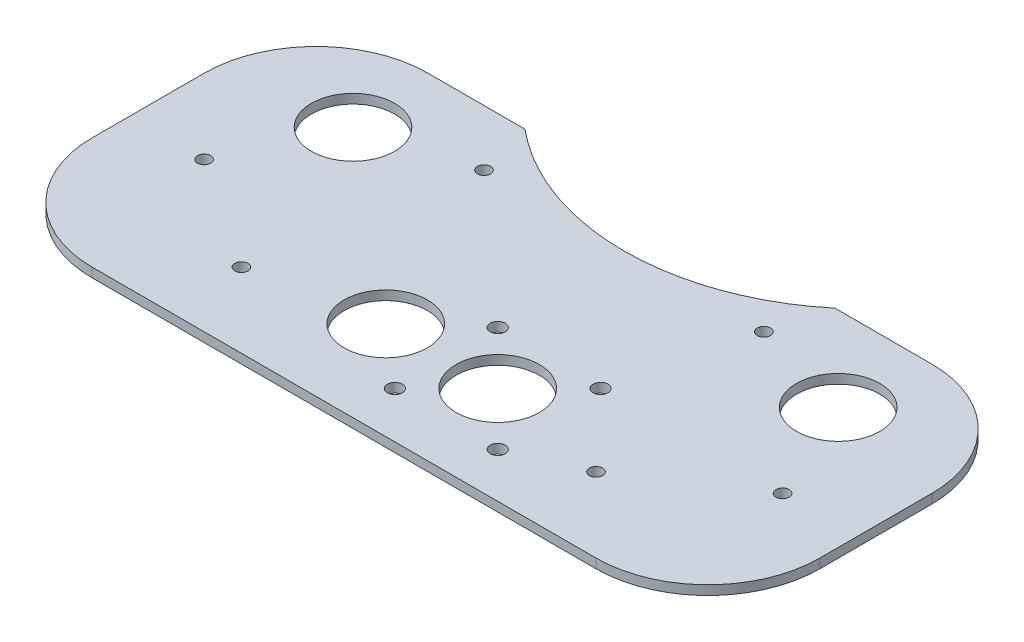
ISO-10303-21;
HEADER;
FILE_DESCRIPTION(('STEP AP214'),'2;1');
FILE_NAME('part.step','',(''),(''),'','','');
FILE_SCHEMA(('AUTOMOTIVE_DESIGN { 1 0 10303 214 1 1 1 1 }'));
ENDSEC;
DATA;
#1=APPLICATION_CONTEXT('core data for automotive mechanical design processes');
#2=APPLICATION_PROTOCOL_DEFINITION('international standard','automotive_design',2000,#1);
#3=PRODUCT_CONTEXT('',#1,'mechanical');
#4=PRODUCT('Part','Part','',(#3));
#5=PRODUCT_RELATED_PRODUCT_CATEGORY('part','',(#4));
#6=PRODUCT_DEFINITION_FORMATION('','',#4);
#7=PRODUCT_DEFINITION_CONTEXT('part definition',#1,'design');
#8=PRODUCT_DEFINITION('design','',#6,#7);
#9=PRODUCT_DEFINITION_SHAPE('','',#8);
#10=(LENGTH_UNIT() NAMED_UNIT(*) SI_UNIT(.MILLI.,.METRE.));
#11=(NAMED_UNIT(*) PLANE_ANGLE_UNIT() SI_UNIT($,.RADIAN.));
#12=(NAMED_UNIT(*) SI_UNIT($,.STERADIAN.) SOLID_ANGLE_UNIT());
#13=UNCERTAINTY_MEASURE_WITH_UNIT(LENGTH_MEASURE(1.E-05),#10,'distance_accuracy_value','');
#14=(GEOMETRIC_REPRESENTATION_CONTEXT(3) GLOBAL_UNCERTAINTY_ASSIGNED_CONTEXT((#13)) GLOBAL_UNIT_ASSIGNED_CONTEXT((#10,
#11,#12)) REPRESENTATION_CONTEXT('',''));
#15=CARTESIAN_POINT('',(0.,0.,0.));
#16=DIRECTION('',(0.,0.,1.));
#17=DIRECTION('',(1.,0.,0.));
#18=AXIS2_PLACEMENT_3D('',#15,#16,#17);
#19=CARTESIAN_POINT('',(0.,3.175,-120.65));
#20=DIRECTION('',(0.,1.,0.));
#21=DIRECTION('',(0.,0.,1.));
#22=AXIS2_PLACEMENT_3D('',#19,#20,#21);
#23=PLANE('',#22);
#24=CARTESIAN_POINT('',(-19.05,3.175,23.9069424475209));
#25=DIRECTION('',(0.,-1.,0.));
#26=DIRECTION('',(0.,0.,-1.));
#27=AXIS2_PLACEMENT_3D('',#24,#25,#26);
#28=CIRCLE('',#27,14.1605);
#29=CARTESIAN_POINT('',(-19.05,3.175,9.74644244752094));
#30=VERTEX_POINT('',#29);
#31=EDGE_CURVE('E401',#30,#30,#28,.T.);
#32=ORIENTED_EDGE('',*,*,#31,.T.);
#33=EDGE_LOOP('',(#32));
#34=FACE_BOUND('',#33,.T.);
#35=CARTESIAN_POINT('',(-98.425,3.175,6.34999999999999));
#36=DIRECTION('',(0.,1.,0.));
#37=DIRECTION('',(0.,0.,1.));
#38=AXIS2_PLACEMENT_3D('',#35,#36,#37);
#39=CIRCLE('',#38,2.24789999999998);
#40=CARTESIAN_POINT('',(-98.425,3.175,8.59789999999998));
#41=VERTEX_POINT('',#40);
#42=EDGE_CURVE('E405',#41,#41,#39,.T.);
#43=ORIENTED_EDGE('',*,*,#42,.F.);
#44=EDGE_LOOP('',(#43));
#45=FACE_BOUND('',#44,.T.);
#46=CARTESIAN_POINT('',(-60.325,3.175,31.75));
#47=DIRECTION('',(0.,1.,0.));
#48=DIRECTION('',(0.,0.,1.));
#49=AXIS2_PLACEMENT_3D('',#46,#47,#48);
#50=CIRCLE('',#49,2.24789999999998);
#51=CARTESIAN_POINT('',(-60.325,3.175,33.9979));
#52=VERTEX_POINT('',#51);
#53=EDGE_CURVE('E414',#52,#52,#50,.T.);
#54=ORIENTED_EDGE('',*,*,#53,.F.);
#55=EDGE_LOOP('',(#54));
#56=FACE_BOUND('',#55,.T.);
#57=CARTESIAN_POINT('',(-47.625,3.175,-38.1));
#58=DIRECTION('',(0.,1.,0.));
#59=DIRECTION('',(0.,0.,1.));
#60=AXIS2_PLACEMENT_3D('',#57,#58,#59);
#61=CIRCLE('',#60,2.24789999999998);
#62=CARTESIAN_POINT('',(-47.625,3.175,-35.8521));
#63=VERTEX_POINT('',#62);
#64=EDGE_CURVE('E420',#63,#63,#61,.T.);
#65=ORIENTED_EDGE('',*,*,#64,.F.);
#66=EDGE_LOOP('',(#65));
#67=FACE_BOUND('',#66,.T.);
#68=CARTESIAN_POINT('',(47.625,3.175,-38.1));
#69=DIRECTION('',(0.,1.,0.));
#70=DIRECTION('',(0.,0.,1.));
#71=AXIS2_PLACEMENT_3D('',#68,#69,#70);
#72=CIRCLE('',#71,2.24789999999998);
#73=CARTESIAN_POINT('',(47.625,3.175,-35.8521));
#74=VERTEX_POINT('',#73);
#75=EDGE_CURVE('E426',#74,#74,#72,.T.);
#76=ORIENTED_EDGE('',*,*,#75,.F.);
#77=EDGE_LOOP('',(#76));
#78=FACE_BOUND('',#77,.T.);
#79=CARTESIAN_POINT('',(60.325,3.175,31.75));
#80=DIRECTION('',(0.,1.,0.));
#81=DIRECTION('',(0.,0.,1.));
#82=AXIS2_PLACEMENT_3D('',#79,#80,#81);
#83=CIRCLE('',#82,2.24789999999998);
#84=CARTESIAN_POINT('',(60.325,3.175,33.9979));
#85=VERTEX_POINT('',#84);
#86=EDGE_CURVE('E432',#85,#85,#83,.T.);
#87=ORIENTED_EDGE('',*,*,#86,.F.);
#88=EDGE_LOOP('',(#87));
#89=FACE_BOUND('',#88,.T.);
#90=CARTESIAN_POINT('',(98.425,3.175,6.34999999999999));
#91=DIRECTION('',(0.,1.,0.));
#92=DIRECTION('',(0.,0.,1.));
#93=AXIS2_PLACEMENT_3D('',#90,#91,#92);
#94=CIRCLE('',#93,2.24789999999998);
#95=CARTESIAN_POINT('',(98.425,3.175,8.59789999999998));
#96=VERTEX_POINT('',#95);
#97=EDGE_CURVE('E334',#96,#96,#94,.T.);
#98=ORIENTED_EDGE('',*,*,#97,.F.);
#99=EDGE_LOOP('',(#98));
#100=FACE_BOUND('',#99,.T.);
#101=DIRECTION('',(0.,0.,-1.));
#102=VECTOR('',#101,1.);
#103=CARTESIAN_POINT('',(-123.825,3.175,57.15));
#104=LINE('',#103,#102);
#105=CARTESIAN_POINT('',(-123.825,3.175,19.05));
#106=VERTEX_POINT('',#105);
#107=CARTESIAN_POINT('',(-123.825,3.175,-19.05));
#108=VERTEX_POINT('',#107);
#109=EDGE_CURVE('E135',#106,#108,#104,.T.);
#110=ORIENTED_EDGE('',*,*,#109,.F.);
#111=CARTESIAN_POINT('',(-85.725,3.175,19.05));
#112=DIRECTION('',(0.,1.,0.));
#113=DIRECTION('',(0.,0.,1.));
#114=AXIS2_PLACEMENT_3D('',#111,#112,#113);
#115=CIRCLE('',#114,38.1);
#116=CARTESIAN_POINT('',(-85.725,3.175,57.15));
#117=VERTEX_POINT('',#116);
#118=EDGE_CURVE('E189',#106,#117,#115,.T.);
#119=ORIENTED_EDGE('',*,*,#118,.T.);
#120=DIRECTION('',(1.,0.,0.));
#121=VECTOR('',#120,1.);
#122=CARTESIAN_POINT('',(-123.825,3.175,57.15));
#123=LINE('',#122,#121);
#124=CARTESIAN_POINT('',(85.725,3.175,57.15));
#125=VERTEX_POINT('',#124);
#126=EDGE_CURVE('E147',#117,#125,#123,.T.);
#127=ORIENTED_EDGE('',*,*,#126,.T.);
#128=CARTESIAN_POINT('',(85.725,3.175,19.05));
#129=DIRECTION('',(0.,1.,0.));
#130=DIRECTION('',(0.,0.,1.));
#131=AXIS2_PLACEMENT_3D('',#128,#129,#130);
#132=CIRCLE('',#131,38.1);
#133=CARTESIAN_POINT('',(123.825,3.175,19.05));
#134=VERTEX_POINT('',#133);
#135=EDGE_CURVE('E187',#125,#134,#132,.T.);
#136=ORIENTED_EDGE('',*,*,#135,.T.);
#137=DIRECTION('',(0.,0.,-1.));
#138=VECTOR('',#137,1.);
#139=CARTESIAN_POINT('',(123.825,3.175,57.15));
#140=LINE('',#139,#138);
#141=CARTESIAN_POINT('',(123.825,3.175,-19.05));
#142=VERTEX_POINT('',#141);
#143=EDGE_CURVE('E142',#134,#142,#140,.T.);
#144=ORIENTED_EDGE('',*,*,#143,.T.);
#145=CARTESIAN_POINT('',(85.725,3.175,-19.05));
#146=DIRECTION('',(0.,1.,0.));
#147=DIRECTION('',(0.,0.,1.));
#148=AXIS2_PLACEMENT_3D('',#145,#146,#147);
#149=CIRCLE('',#148,38.1);
#150=CARTESIAN_POINT('',(85.725,3.175,-57.15));
#151=VERTEX_POINT('',#150);
#152=EDGE_CURVE('E53',#142,#151,#149,.T.);
#153=ORIENTED_EDGE('',*,*,#152,.T.);
#154=DIRECTION('',(-1.,0.,0.));
#155=VECTOR('',#154,1.);
#156=CARTESIAN_POINT('',(123.825,3.175,-57.15));
#157=LINE('',#156,#155);
#158=CARTESIAN_POINT('',(52.7470615295298,3.175,-57.15));
#159=VERTEX_POINT('',#158);
#160=EDGE_CURVE('E139',#151,#159,#157,.T.);
#161=ORIENTED_EDGE('',*,*,#160,.T.);
#162=CARTESIAN_POINT('',(0.,3.175,-120.65));
#163=DIRECTION('',(0.,1.,0.));
#164=DIRECTION('',(0.,0.,1.));
#165=AXIS2_PLACEMENT_3D('',#162,#163,#164);
#166=CIRCLE('',#165,82.55);
#167=CARTESIAN_POINT('',(-52.7470615295298,3.175,-57.15));
#168=VERTEX_POINT('',#167);
#169=EDGE_CURVE('E125',#168,#159,#166,.T.);
#170=ORIENTED_EDGE('',*,*,#169,.F.);
#171=DIRECTION('',(1.,0.,0.));
#172=VECTOR('',#171,1.);
#173=CARTESIAN_POINT('',(-123.825,3.175,-57.15));
#174=LINE('',#173,#172);
#175=CARTESIAN_POINT('',(-85.725,3.175,-57.15));
#176=VERTEX_POINT('',#175);
#177=EDGE_CURVE('E116',#176,#168,#174,.T.);
#178=ORIENTED_EDGE('',*,*,#177,.F.);
#179=CARTESIAN_POINT('',(-85.725,3.175,-19.05));
#180=DIRECTION('',(0.,1.,0.));
#181=DIRECTION('',(0.,0.,1.));
#182=AXIS2_PLACEMENT_3D('',#179,#180,#181);
#183=CIRCLE('',#182,38.1);
#184=EDGE_CURVE('E184',#176,#108,#183,.T.);
#185=ORIENTED_EDGE('',*,*,#184,.T.);
#186=EDGE_LOOP('',(#110,#119,#127,#136,#144,#153,#161,#170,#178,#185));
#187=FACE_BOUND('',#186,.T.);
#188=CARTESIAN_POINT('',(19.05,3.175,23.9069424475209));
#189=DIRECTION('',(0.,1.,0.));
#190=DIRECTION('',(0.,0.,1.));
#191=AXIS2_PLACEMENT_3D('',#188,#189,#190);
#192=CIRCLE('',#191,14.1605);
#193=CARTESIAN_POINT('',(19.05,3.175,38.0674424475209));
#194=VERTEX_POINT('',#193);
#195=EDGE_CURVE('E297',#194,#194,#192,.T.);
#196=ORIENTED_EDGE('',*,*,#195,.F.);
#197=EDGE_LOOP('',(#196));
#198=FACE_BOUND('',#197,.T.);
#199=CARTESIAN_POINT('',(37.0105122421383,3.175,41.8674546896592));
#200=DIRECTION('',(0.,1.,0.));
#201=DIRECTION('',(0.,0.,1.));
#202=AXIS2_PLACEMENT_3D('',#199,#200,#201);
#203=CIRCLE('',#202,2.5527);
#204=CARTESIAN_POINT('',(37.0105122421383,3.175,44.4201546896592));
#205=VERTEX_POINT('',#204);
#206=EDGE_CURVE('E293',#205,#205,#203,.T.);
#207=ORIENTED_EDGE('',*,*,#206,.F.);
#208=EDGE_LOOP('',(#207));
#209=FACE_BOUND('',#208,.T.);
#210=CARTESIAN_POINT('',(1.08948775786164,3.175,5.94643020538265));
#211=DIRECTION('',(0.,1.,0.));
#212=DIRECTION('',(0.,0.,1.));
#213=AXIS2_PLACEMENT_3D('',#210,#211,#212);
#214=CIRCLE('',#213,2.5527);
#215=CARTESIAN_POINT('',(1.08948775786164,3.175,8.49913020538265));
#216=VERTEX_POINT('',#215);
#217=EDGE_CURVE('E300',#216,#216,#214,.T.);
#218=ORIENTED_EDGE('',*,*,#217,.F.);
#219=EDGE_LOOP('',(#218));
#220=FACE_BOUND('',#219,.T.);
#221=CARTESIAN_POINT('',(36.55,3.175,6.40694244752094));
#222=DIRECTION('',(0.,1.,0.));
#223=DIRECTION('',(0.,0.,1.));
#224=AXIS2_PLACEMENT_3D('',#221,#222,#223);
#225=CIRCLE('',#224,2.5527);
#226=CARTESIAN_POINT('',(36.55,3.175,8.95964244752094));
#227=VERTEX_POINT('',#226);
#228=EDGE_CURVE('E317',#227,#227,#225,.T.);
#229=ORIENTED_EDGE('',*,*,#228,.F.);
#230=EDGE_LOOP('',(#229));
#231=FACE_BOUND('',#230,.T.);
#232=CARTESIAN_POINT('',(1.54999999999999,3.175,41.4069424475209));
#233=DIRECTION('',(0.,1.,0.));
#234=DIRECTION('',(0.,0.,1.));
#235=AXIS2_PLACEMENT_3D('',#232,#233,#234);
#236=CIRCLE('',#235,2.5527);
#237=CARTESIAN_POINT('',(1.54999999999999,3.175,43.9596424475209));
#238=VERTEX_POINT('',#237);
#239=EDGE_CURVE('E321',#238,#238,#236,.T.);
#240=ORIENTED_EDGE('',*,*,#239,.F.);
#241=EDGE_LOOP('',(#240));
#242=FACE_BOUND('',#241,.T.);
#243=CARTESIAN_POINT('',(82.55,3.175,-28.448));
#244=DIRECTION('',(0.,-1.,0.));
#245=DIRECTION('',(0.,0.,-1.));
#246=AXIS2_PLACEMENT_3D('',#243,#244,#245);
#247=CIRCLE('',#246,14.1605);
#248=CARTESIAN_POINT('',(82.55,3.175,-42.6085));
#249=VERTEX_POINT('',#248);
#250=EDGE_CURVE('E325',#249,#249,#247,.T.);
#251=ORIENTED_EDGE('',*,*,#250,.T.);
#252=EDGE_LOOP('',(#251));
#253=FACE_BOUND('',#252,.T.);
#254=CARTESIAN_POINT('',(-82.55,3.175,-28.448));
#255=DIRECTION('',(0.,-1.,0.));
#256=DIRECTION('',(0.,0.,-1.));
#257=AXIS2_PLACEMENT_3D('',#254,#255,#256);
#258=CIRCLE('',#257,14.1605);
#259=CARTESIAN_POINT('',(-82.55,3.175,-42.6085));
#260=VERTEX_POINT('',#259);
#261=EDGE_CURVE('E328',#260,#260,#258,.T.);
#262=ORIENTED_EDGE('',*,*,#261,.T.);
#263=EDGE_LOOP('',(#262));
#264=FACE_BOUND('',#263,.T.);
#265=ADVANCED_FACE('F37',(#34,#45,#56,#67,#78,#89,#100,#187,#198,#209,#220,#231,#242,#253,#264),
#23,.T.);
#266=CARTESIAN_POINT('',(-123.825,3.175,-57.15));
#267=DIRECTION('',(0.,0.,-1.));
#268=DIRECTION('',(-1.,0.,0.));
#269=AXIS2_PLACEMENT_3D('',#266,#267,#268);
#270=PLANE('',#269);
#271=DIRECTION('',(1.,0.,0.));
#272=VECTOR('',#271,1.);
#273=CARTESIAN_POINT('',(-123.825,0.,-57.15));
#274=LINE('',#273,#272);
#275=CARTESIAN_POINT('',(-85.725,0.,-57.15));
#276=VERTEX_POINT('',#275);
#277=CARTESIAN_POINT('',(-52.7470615295298,0.,-57.15));
#278=VERTEX_POINT('',#277);
#279=EDGE_CURVE('E152',#276,#278,#274,.T.);
#280=ORIENTED_EDGE('',*,*,#279,.F.);
#281=DIRECTION('',(0.,-1.,0.));
#282=VECTOR('',#281,1.);
#283=CARTESIAN_POINT('',(-85.725,3.175,-57.15));
#284=LINE('',#283,#282);
#285=EDGE_CURVE('E11',#276,#176,#284,.F.);
#286=ORIENTED_EDGE('',*,*,#285,.T.);
#287=ORIENTED_EDGE('',*,*,#177,.T.);
#288=DIRECTION('',(0.,-1.,0.));
#289=VECTOR('',#288,1.);
#290=CARTESIAN_POINT('',(-52.7470615295298,3.175,-57.15));
#291=LINE('',#290,#289);
#292=EDGE_CURVE('E120',#168,#278,#291,.T.);
#293=ORIENTED_EDGE('',*,*,#292,.T.);
#294=EDGE_LOOP('',(#280,#286,#287,#293));
#295=FACE_BOUND('',#294,.T.);
#296=ADVANCED_FACE('F119',(#295),#270,.T.);
#297=CARTESIAN_POINT('',(-123.825,3.175,57.15));
#298=DIRECTION('',(-1.,0.,0.));
#299=DIRECTION('',(0.,0.,1.));
#300=AXIS2_PLACEMENT_3D('',#297,#298,#299);
#301=PLANE('',#300);
#302=DIRECTION('',(0.,0.,-1.));
#303=VECTOR('',#302,1.);
#304=CARTESIAN_POINT('',(-123.825,0.,57.15));
#305=LINE('',#304,#303);
#306=CARTESIAN_POINT('',(-123.825,0.,19.05));
#307=VERTEX_POINT('',#306);
#308=CARTESIAN_POINT('',(-123.825,0.,-19.05));
#309=VERTEX_POINT('',#308);
#310=EDGE_CURVE('E126',#307,#309,#305,.T.);
#311=ORIENTED_EDGE('',*,*,#310,.F.);
#312=DIRECTION('',(0.,-1.,0.));
#313=VECTOR('',#312,1.);
#314=CARTESIAN_POINT('',(-123.825,3.175,19.05));
#315=LINE('',#314,#313);
#316=EDGE_CURVE('E182',#307,#106,#315,.F.);
#317=ORIENTED_EDGE('',*,*,#316,.T.);
#318=ORIENTED_EDGE('',*,*,#109,.T.);
#319=DIRECTION('',(0.,-1.,0.));
#320=VECTOR('',#319,1.);
#321=CARTESIAN_POINT('',(-123.825,3.175,-19.05));
#322=LINE('',#321,#320);
#323=EDGE_CURVE('E179',#108,#309,#322,.T.);
#324=ORIENTED_EDGE('',*,*,#323,.T.);
#325=EDGE_LOOP('',(#311,#317,#318,#324));
#326=FACE_BOUND('',#325,.T.);
#327=ADVANCED_FACE('F210',(#326),#301,.T.);
#328=CARTESIAN_POINT('',(-123.825,3.175,57.15));
#329=DIRECTION('',(0.,0.,-1.));
#330=DIRECTION('',(-1.,0.,0.));
#331=AXIS2_PLACEMENT_3D('',#328,#329,#330);
#332=PLANE('',#331);
#333=ORIENTED_EDGE('',*,*,#126,.F.);
#334=DIRECTION('',(0.,-1.,0.));
#335=VECTOR('',#334,1.);
#336=CARTESIAN_POINT('',(-85.725,0.,57.15));
#337=LINE('',#336,#335);
#338=CARTESIAN_POINT('',(-85.725,0.,57.15));
#339=VERTEX_POINT('',#338);
#340=EDGE_CURVE('E168',#117,#339,#337,.T.);
#341=ORIENTED_EDGE('',*,*,#340,.T.);
#342=DIRECTION('',(1.,0.,0.));
#343=VECTOR('',#342,1.);
#344=CARTESIAN_POINT('',(-123.825,0.,57.15));
#345=LINE('',#344,#343);
#346=CARTESIAN_POINT('',(85.725,0.,57.15));
#347=VERTEX_POINT('',#346);
#348=EDGE_CURVE('E160',#339,#347,#345,.T.);
#349=ORIENTED_EDGE('',*,*,#348,.T.);
#350=DIRECTION('',(0.,-1.,0.));
#351=VECTOR('',#350,1.);
#352=CARTESIAN_POINT('',(85.725,3.175,57.15));
#353=LINE('',#352,#351);
#354=EDGE_CURVE('E165',#347,#125,#353,.F.);
#355=ORIENTED_EDGE('',*,*,#354,.T.);
#356=EDGE_LOOP('',(#333,#341,#349,#355));
#357=FACE_BOUND('',#356,.T.);
#358=ADVANCED_FACE('F218',(#357),#332,.F.);
#359=CARTESIAN_POINT('',(123.825,3.175,57.15));
#360=DIRECTION('',(-1.,0.,0.));
#361=DIRECTION('',(0.,0.,1.));
#362=AXIS2_PLACEMENT_3D('',#359,#360,#361);
#363=PLANE('',#362);
#364=ORIENTED_EDGE('',*,*,#143,.F.);
#365=DIRECTION('',(0.,-1.,0.));
#366=VECTOR('',#365,1.);
#367=CARTESIAN_POINT('',(123.825,3.175,19.05));
#368=LINE('',#367,#366);
#369=CARTESIAN_POINT('',(123.825,0.,19.05));
#370=VERTEX_POINT('',#369);
#371=EDGE_CURVE('E192',#134,#370,#368,.T.);
#372=ORIENTED_EDGE('',*,*,#371,.T.);
#373=DIRECTION('',(0.,0.,-1.));
#374=VECTOR('',#373,1.);
#375=CARTESIAN_POINT('',(123.825,0.,57.15));
#376=LINE('',#375,#374);
#377=CARTESIAN_POINT('',(123.825,0.,-19.05));
#378=VERTEX_POINT('',#377);
#379=EDGE_CURVE('E158',#370,#378,#376,.T.);
#380=ORIENTED_EDGE('',*,*,#379,.T.);
#381=DIRECTION('',(0.,-1.,0.));
#382=VECTOR('',#381,1.);
#383=CARTESIAN_POINT('',(123.825,3.175,-19.05));
#384=LINE('',#383,#382);
#385=EDGE_CURVE('E61',#378,#142,#384,.F.);
#386=ORIENTED_EDGE('',*,*,#385,.T.);
#387=EDGE_LOOP('',(#364,#372,#380,#386));
#388=FACE_BOUND('',#387,.T.);
#389=ADVANCED_FACE('F223',(#388),#363,.F.);
#390=CARTESIAN_POINT('',(123.825,3.175,-57.15));
#391=DIRECTION('',(0.,0.,1.));
#392=DIRECTION('',(1.,0.,0.));
#393=AXIS2_PLACEMENT_3D('',#390,#391,#392);
#394=PLANE('',#393);
#395=ORIENTED_EDGE('',*,*,#160,.F.);
#396=DIRECTION('',(0.,-1.,0.));
#397=VECTOR('',#396,1.);
#398=CARTESIAN_POINT('',(85.725,3.175,-57.15));
#399=LINE('',#398,#397);
#400=CARTESIAN_POINT('',(85.725,0.,-57.15));
#401=VERTEX_POINT('',#400);
#402=EDGE_CURVE('E46',#151,#401,#399,.T.);
#403=ORIENTED_EDGE('',*,*,#402,.T.);
#404=DIRECTION('',(-1.,0.,0.));
#405=VECTOR('',#404,1.);
#406=CARTESIAN_POINT('',(123.825,0.,-57.15));
#407=LINE('',#406,#405);
#408=CARTESIAN_POINT('',(52.7470615295298,0.,-57.15));
#409=VERTEX_POINT('',#408);
#410=EDGE_CURVE('E156',#401,#409,#407,.T.);
#411=ORIENTED_EDGE('',*,*,#410,.T.);
#412=DIRECTION('',(0.,-1.,0.));
#413=VECTOR('',#412,1.);
#414=CARTESIAN_POINT('',(52.7470615295298,3.175,-57.15));
#415=LINE('',#414,#413);
#416=EDGE_CURVE('E134',#159,#409,#415,.T.);
#417=ORIENTED_EDGE('',*,*,#416,.F.);
#418=EDGE_LOOP('',(#395,#403,#411,#417));
#419=FACE_BOUND('',#418,.T.);
#420=ADVANCED_FACE('F199',(#419),#394,.F.);
#421=CARTESIAN_POINT('',(0.,3.175,-120.65));
#422=DIRECTION('',(0.,-1.,0.));
#423=DIRECTION('',(0.,0.,-1.));
#424=AXIS2_PLACEMENT_3D('',#421,#422,#423);
#425=CYLINDRICAL_SURFACE('',#424,82.55);
#426=CARTESIAN_POINT('',(0.,0.,-120.65));
#427=DIRECTION('',(0.,1.,0.));
#428=DIRECTION('',(0.,0.,1.));
#429=AXIS2_PLACEMENT_3D('',#426,#427,#428);
#430=CIRCLE('',#429,82.55);
#431=EDGE_CURVE('E133',#278,#409,#430,.T.);
#432=ORIENTED_EDGE('',*,*,#431,.F.);
#433=ORIENTED_EDGE('',*,*,#292,.F.);
#434=ORIENTED_EDGE('',*,*,#169,.T.);
#435=ORIENTED_EDGE('',*,*,#416,.T.);
#436=EDGE_LOOP('',(#432,#433,#434,#435));
#437=FACE_BOUND('',#436,.T.);
#438=ADVANCED_FACE('F130',(#437),#425,.F.);
#439=CARTESIAN_POINT('',(0.,0.,-120.65));
#440=DIRECTION('',(0.,1.,0.));
#441=DIRECTION('',(0.,0.,1.));
#442=AXIS2_PLACEMENT_3D('',#439,#440,#441);
#443=PLANE('',#442);
#444=CARTESIAN_POINT('',(-19.05,0.,23.9069424475209));
#445=DIRECTION('',(0.,1.,0.));
#446=DIRECTION('',(0.,0.,1.));
#447=AXIS2_PLACEMENT_3D('',#444,#445,#446);
#448=CIRCLE('',#447,14.1605);
#449=CARTESIAN_POINT('',(-19.05,0.,38.0674424475209));
#450=VERTEX_POINT('',#449);
#451=EDGE_CURVE('E404',#450,#450,#448,.T.);
#452=ORIENTED_EDGE('',*,*,#451,.T.);
#453=EDGE_LOOP('',(#452));
#454=FACE_BOUND('',#453,.T.);
#455=CARTESIAN_POINT('',(-98.425,0.,6.34999999999999));
#456=DIRECTION('',(0.,1.,0.));
#457=DIRECTION('',(0.,0.,1.));
#458=AXIS2_PLACEMENT_3D('',#455,#456,#457);
#459=CIRCLE('',#458,2.24789999999998);
#460=CARTESIAN_POINT('',(-98.425,0.,8.59789999999998));
#461=VERTEX_POINT('',#460);
#462=EDGE_CURVE('E408',#461,#461,#459,.T.);
#463=ORIENTED_EDGE('',*,*,#462,.T.);
#464=EDGE_LOOP('',(#463));
#465=FACE_BOUND('',#464,.T.);
#466=CARTESIAN_POINT('',(-60.325,0.,31.75));
#467=DIRECTION('',(0.,1.,0.));
#468=DIRECTION('',(0.,0.,1.));
#469=AXIS2_PLACEMENT_3D('',#466,#467,#468);
#470=CIRCLE('',#469,2.24789999999998);
#471=CARTESIAN_POINT('',(-60.325,0.,33.9979));
#472=VERTEX_POINT('',#471);
#473=EDGE_CURVE('E417',#472,#472,#470,.T.);
#474=ORIENTED_EDGE('',*,*,#473,.T.);
#475=EDGE_LOOP('',(#474));
#476=FACE_BOUND('',#475,.T.);
#477=CARTESIAN_POINT('',(-47.625,0.,-38.1));
#478=DIRECTION('',(0.,1.,0.));
#479=DIRECTION('',(0.,0.,1.));
#480=AXIS2_PLACEMENT_3D('',#477,#478,#479);
#481=CIRCLE('',#480,2.24789999999998);
#482=CARTESIAN_POINT('',(-47.625,0.,-35.8521));
#483=VERTEX_POINT('',#482);
#484=EDGE_CURVE('E423',#483,#483,#481,.T.);
#485=ORIENTED_EDGE('',*,*,#484,.T.);
#486=EDGE_LOOP('',(#485));
#487=FACE_BOUND('',#486,.T.);
#488=CARTESIAN_POINT('',(47.625,0.,-38.1));
#489=DIRECTION('',(0.,1.,0.));
#490=DIRECTION('',(0.,0.,1.));
#491=AXIS2_PLACEMENT_3D('',#488,#489,#490);
#492=CIRCLE('',#491,2.24789999999998);
#493=CARTESIAN_POINT('',(47.625,0.,-35.8521));
#494=VERTEX_POINT('',#493);
#495=EDGE_CURVE('E429',#494,#494,#492,.T.);
#496=ORIENTED_EDGE('',*,*,#495,.T.);
#497=EDGE_LOOP('',(#496));
#498=FACE_BOUND('',#497,.T.);
#499=CARTESIAN_POINT('',(60.325,0.,31.75));
#500=DIRECTION('',(0.,1.,0.));
#501=DIRECTION('',(0.,0.,1.));
#502=AXIS2_PLACEMENT_3D('',#499,#500,#501);
#503=CIRCLE('',#502,2.24789999999998);
#504=CARTESIAN_POINT('',(60.325,0.,33.9979));
#505=VERTEX_POINT('',#504);
#506=EDGE_CURVE('E435',#505,#505,#503,.T.);
#507=ORIENTED_EDGE('',*,*,#506,.T.);
#508=EDGE_LOOP('',(#507));
#509=FACE_BOUND('',#508,.T.);
#510=CARTESIAN_POINT('',(98.425,0.,6.34999999999999));
#511=DIRECTION('',(0.,1.,0.));
#512=DIRECTION('',(0.,0.,1.));
#513=AXIS2_PLACEMENT_3D('',#510,#511,#512);
#514=CIRCLE('',#513,2.24789999999998);
#515=CARTESIAN_POINT('',(98.425,0.,8.59789999999998));
#516=VERTEX_POINT('',#515);
#517=EDGE_CURVE('E330',#516,#516,#514,.T.);
#518=ORIENTED_EDGE('',*,*,#517,.T.);
#519=EDGE_LOOP('',(#518));
#520=FACE_BOUND('',#519,.T.);
#521=CARTESIAN_POINT('',(-82.55,0.,-28.448));
#522=DIRECTION('',(0.,1.,0.));
#523=DIRECTION('',(0.,0.,1.));
#524=AXIS2_PLACEMENT_3D('',#521,#522,#523);
#525=CIRCLE('',#524,14.1605);
#526=CARTESIAN_POINT('',(-82.55,0.,-14.2875));
#527=VERTEX_POINT('',#526);
#528=EDGE_CURVE('E41',#527,#527,#525,.T.);
#529=ORIENTED_EDGE('',*,*,#528,.T.);
#530=EDGE_LOOP('',(#529));
#531=FACE_BOUND('',#530,.T.);
#532=CARTESIAN_POINT('',(82.55,0.,-28.448));
#533=DIRECTION('',(0.,1.,0.));
#534=DIRECTION('',(0.,0.,1.));
#535=AXIS2_PLACEMENT_3D('',#532,#533,#534);
#536=CIRCLE('',#535,14.1605);
#537=CARTESIAN_POINT('',(82.55,0.,-14.2875));
#538=VERTEX_POINT('',#537);
#539=EDGE_CURVE('E339',#538,#538,#536,.T.);
#540=ORIENTED_EDGE('',*,*,#539,.T.);
#541=EDGE_LOOP('',(#540));
#542=FACE_BOUND('',#541,.T.);
#543=CARTESIAN_POINT('',(1.54999999999999,0.,41.4069424475209));
#544=DIRECTION('',(0.,1.,0.));
#545=DIRECTION('',(0.,0.,1.));
#546=AXIS2_PLACEMENT_3D('',#543,#544,#545);
#547=CIRCLE('',#546,2.5527);
#548=CARTESIAN_POINT('',(1.54999999999999,0.,43.9596424475209));
#549=VERTEX_POINT('',#548);
#550=EDGE_CURVE('E343',#549,#549,#547,.T.);
#551=ORIENTED_EDGE('',*,*,#550,.T.);
#552=EDGE_LOOP('',(#551));
#553=FACE_BOUND('',#552,.T.);
#554=CARTESIAN_POINT('',(36.55,0.,6.40694244752094));
#555=DIRECTION('',(0.,1.,0.));
#556=DIRECTION('',(0.,0.,1.));
#557=AXIS2_PLACEMENT_3D('',#554,#555,#556);
#558=CIRCLE('',#557,2.5527);
#559=CARTESIAN_POINT('',(36.55,0.,8.95964244752094));
#560=VERTEX_POINT('',#559);
#561=EDGE_CURVE('E347',#560,#560,#558,.T.);
#562=ORIENTED_EDGE('',*,*,#561,.T.);
#563=EDGE_LOOP('',(#562));
#564=FACE_BOUND('',#563,.T.);
#565=CARTESIAN_POINT('',(1.08948775786164,0.,5.94643020538265));
#566=DIRECTION('',(0.,1.,0.));
#567=DIRECTION('',(0.,0.,1.));
#568=AXIS2_PLACEMENT_3D('',#565,#566,#567);
#569=CIRCLE('',#568,2.5527);
#570=CARTESIAN_POINT('',(1.08948775786164,0.,8.49913020538265));
#571=VERTEX_POINT('',#570);
#572=EDGE_CURVE('E295',#571,#571,#569,.T.);
#573=ORIENTED_EDGE('',*,*,#572,.T.);
#574=EDGE_LOOP('',(#573));
#575=FACE_BOUND('',#574,.T.);
#576=CARTESIAN_POINT('',(37.0105122421383,0.,41.8674546896592));
#577=DIRECTION('',(0.,1.,0.));
#578=DIRECTION('',(0.,0.,1.));
#579=AXIS2_PLACEMENT_3D('',#576,#577,#578);
#580=CIRCLE('',#579,2.5527);
#581=CARTESIAN_POINT('',(37.0105122421383,0.,44.4201546896592));
#582=VERTEX_POINT('',#581);
#583=EDGE_CURVE('E290',#582,#582,#580,.T.);
#584=ORIENTED_EDGE('',*,*,#583,.T.);
#585=EDGE_LOOP('',(#584));
#586=FACE_BOUND('',#585,.T.);
#587=CARTESIAN_POINT('',(19.05,0.,23.9069424475209));
#588=DIRECTION('',(0.,1.,0.));
#589=DIRECTION('',(0.,0.,1.));
#590=AXIS2_PLACEMENT_3D('',#587,#588,#589);
#591=CIRCLE('',#590,14.1605);
#592=CARTESIAN_POINT('',(19.05,0.,38.0674424475209));
#593=VERTEX_POINT('',#592);
#594=EDGE_CURVE('E154',#593,#593,#591,.T.);
#595=ORIENTED_EDGE('',*,*,#594,.T.);
#596=EDGE_LOOP('',(#595));
#597=FACE_BOUND('',#596,.T.);
#598=ORIENTED_EDGE('',*,*,#348,.F.);
#599=CARTESIAN_POINT('',(-85.725,0.,19.05));
#600=DIRECTION('',(0.,1.,0.));
#601=DIRECTION('',(0.,0.,1.));
#602=AXIS2_PLACEMENT_3D('',#599,#600,#601);
#603=CIRCLE('',#602,38.1);
#604=EDGE_CURVE('E177',#339,#307,#603,.F.);
#605=ORIENTED_EDGE('',*,*,#604,.T.);
#606=ORIENTED_EDGE('',*,*,#310,.T.);
#607=CARTESIAN_POINT('',(-85.725,0.,-19.05));
#608=DIRECTION('',(0.,1.,0.));
#609=DIRECTION('',(0.,0.,1.));
#610=AXIS2_PLACEMENT_3D('',#607,#608,#609);
#611=CIRCLE('',#610,38.1);
#612=EDGE_CURVE('E171',#309,#276,#611,.F.);
#613=ORIENTED_EDGE('',*,*,#612,.T.);
#614=ORIENTED_EDGE('',*,*,#279,.T.);
#615=ORIENTED_EDGE('',*,*,#431,.T.);
#616=ORIENTED_EDGE('',*,*,#410,.F.);
#617=CARTESIAN_POINT('',(85.725,0.,-19.05));
#618=DIRECTION('',(0.,1.,0.));
#619=DIRECTION('',(0.,0.,1.));
#620=AXIS2_PLACEMENT_3D('',#617,#618,#619);
#621=CIRCLE('',#620,38.1);
#622=EDGE_CURVE('E173',#401,#378,#621,.F.);
#623=ORIENTED_EDGE('',*,*,#622,.T.);
#624=ORIENTED_EDGE('',*,*,#379,.F.);
#625=CARTESIAN_POINT('',(85.725,0.,19.05));
#626=DIRECTION('',(0.,1.,0.));
#627=DIRECTION('',(0.,0.,1.));
#628=AXIS2_PLACEMENT_3D('',#625,#626,#627);
#629=CIRCLE('',#628,38.1);
#630=EDGE_CURVE('E175',#370,#347,#629,.F.);
#631=ORIENTED_EDGE('',*,*,#630,.T.);
#632=EDGE_LOOP('',(#598,#605,#606,#613,#614,#615,#616,#623,#624,#631));
#633=FACE_BOUND('',#632,.T.);
#634=ADVANCED_FACE('F203',(#454,#465,#476,#487,#498,#509,#520,#531,#542,#553,#564,#575,#586,
#597,#633),#443,.F.);
#635=CARTESIAN_POINT('',(19.05,3.175,23.9069424475209));
#636=DIRECTION('',(0.,1.,0.));
#637=DIRECTION('',(0.,0.,1.));
#638=AXIS2_PLACEMENT_3D('',#635,#636,#637);
#639=CYLINDRICAL_SURFACE('',#638,14.1605);
#640=ORIENTED_EDGE('',*,*,#594,.F.);
#641=EDGE_LOOP('',(#640));
#642=FACE_BOUND('',#641,.T.);
#643=ORIENTED_EDGE('',*,*,#195,.T.);
#644=EDGE_LOOP('',(#643));
#645=FACE_BOUND('',#644,.T.);
#646=ADVANCED_FACE('F245',(#642,#645),#639,.F.);
#647=CARTESIAN_POINT('',(37.0105122421383,3.175,41.8674546896592));
#648=DIRECTION('',(0.,1.,0.));
#649=DIRECTION('',(0.,0.,1.));
#650=AXIS2_PLACEMENT_3D('',#647,#648,#649);
#651=CYLINDRICAL_SURFACE('',#650,2.5527);
#652=ORIENTED_EDGE('',*,*,#583,.F.);
#653=EDGE_LOOP('',(#652));
#654=FACE_BOUND('',#653,.T.);
#655=ORIENTED_EDGE('',*,*,#206,.T.);
#656=EDGE_LOOP('',(#655));
#657=FACE_BOUND('',#656,.T.);
#658=ADVANCED_FACE('F279',(#654,#657),#651,.F.);
#659=CARTESIAN_POINT('',(1.08948775786164,3.175,5.94643020538265));
#660=DIRECTION('',(0.,1.,0.));
#661=DIRECTION('',(0.,0.,1.));
#662=AXIS2_PLACEMENT_3D('',#659,#660,#661);
#663=CYLINDRICAL_SURFACE('',#662,2.5527);
#664=ORIENTED_EDGE('',*,*,#572,.F.);
#665=EDGE_LOOP('',(#664));
#666=FACE_BOUND('',#665,.T.);
#667=ORIENTED_EDGE('',*,*,#217,.T.);
#668=EDGE_LOOP('',(#667));
#669=FACE_BOUND('',#668,.T.);
#670=ADVANCED_FACE('F270',(#666,#669),#663,.F.);
#671=CARTESIAN_POINT('',(36.55,3.175,6.40694244752094));
#672=DIRECTION('',(0.,1.,0.));
#673=DIRECTION('',(0.,0.,1.));
#674=AXIS2_PLACEMENT_3D('',#671,#672,#673);
#675=CYLINDRICAL_SURFACE('',#674,2.5527);
#676=ORIENTED_EDGE('',*,*,#561,.F.);
#677=EDGE_LOOP('',(#676));
#678=FACE_BOUND('',#677,.T.);
#679=ORIENTED_EDGE('',*,*,#228,.T.);
#680=EDGE_LOOP('',(#679));
#681=FACE_BOUND('',#680,.T.);
#682=ADVANCED_FACE('F264',(#678,#681),#675,.F.);
#683=CARTESIAN_POINT('',(1.54999999999999,3.175,41.4069424475209));
#684=DIRECTION('',(0.,1.,0.));
#685=DIRECTION('',(0.,0.,1.));
#686=AXIS2_PLACEMENT_3D('',#683,#684,#685);
#687=CYLINDRICAL_SURFACE('',#686,2.5527);
#688=ORIENTED_EDGE('',*,*,#550,.F.);
#689=EDGE_LOOP('',(#688));
#690=FACE_BOUND('',#689,.T.);
#691=ORIENTED_EDGE('',*,*,#239,.T.);
#692=EDGE_LOOP('',(#691));
#693=FACE_BOUND('',#692,.T.);
#694=ADVANCED_FACE('F260',(#690,#693),#687,.F.);
#695=CARTESIAN_POINT('',(-85.725,3.175,19.05));
#696=DIRECTION('',(0.,1.,0.));
#697=DIRECTION('',(0.,0.,1.));
#698=AXIS2_PLACEMENT_3D('',#695,#696,#697);
#699=CYLINDRICAL_SURFACE('',#698,38.1);
#700=ORIENTED_EDGE('',*,*,#118,.F.);
#701=ORIENTED_EDGE('',*,*,#316,.F.);
#702=ORIENTED_EDGE('',*,*,#604,.F.);
#703=ORIENTED_EDGE('',*,*,#340,.F.);
#704=EDGE_LOOP('',(#700,#701,#702,#703));
#705=FACE_BOUND('',#704,.T.);
#706=ADVANCED_FACE('F213',(#705),#699,.T.);
#707=CARTESIAN_POINT('',(85.725,3.175,19.05));
#708=DIRECTION('',(0.,-1.,0.));
#709=DIRECTION('',(0.,0.,-1.));
#710=AXIS2_PLACEMENT_3D('',#707,#708,#709);
#711=CYLINDRICAL_SURFACE('',#710,38.1);
#712=ORIENTED_EDGE('',*,*,#135,.F.);
#713=ORIENTED_EDGE('',*,*,#354,.F.);
#714=ORIENTED_EDGE('',*,*,#630,.F.);
#715=ORIENTED_EDGE('',*,*,#371,.F.);
#716=EDGE_LOOP('',(#712,#713,#714,#715));
#717=FACE_BOUND('',#716,.T.);
#718=ADVANCED_FACE('F221',(#717),#711,.T.);
#719=CARTESIAN_POINT('',(85.725,3.175,-19.05));
#720=DIRECTION('',(0.,-1.,0.));
#721=DIRECTION('',(0.,0.,-1.));
#722=AXIS2_PLACEMENT_3D('',#719,#720,#721);
#723=CYLINDRICAL_SURFACE('',#722,38.1);
#724=ORIENTED_EDGE('',*,*,#152,.F.);
#725=ORIENTED_EDGE('',*,*,#385,.F.);
#726=ORIENTED_EDGE('',*,*,#622,.F.);
#727=ORIENTED_EDGE('',*,*,#402,.F.);
#728=EDGE_LOOP('',(#724,#725,#726,#727));
#729=FACE_BOUND('',#728,.T.);
#730=ADVANCED_FACE('F224',(#729),#723,.T.);
#731=CARTESIAN_POINT('',(-85.725,3.175,-19.05));
#732=DIRECTION('',(0.,-1.,0.));
#733=DIRECTION('',(0.,0.,-1.));
#734=AXIS2_PLACEMENT_3D('',#731,#732,#733);
#735=CYLINDRICAL_SURFACE('',#734,38.1);
#736=ORIENTED_EDGE('',*,*,#184,.F.);
#737=ORIENTED_EDGE('',*,*,#285,.F.);
#738=ORIENTED_EDGE('',*,*,#612,.F.);
#739=ORIENTED_EDGE('',*,*,#323,.F.);
#740=EDGE_LOOP('',(#736,#737,#738,#739));
#741=FACE_BOUND('',#740,.T.);
#742=ADVANCED_FACE('F39',(#741),#735,.T.);
#743=CARTESIAN_POINT('',(82.55,-34.925,-28.448));
#744=DIRECTION('',(0.,-1.,0.));
#745=DIRECTION('',(0.,0.,-1.));
#746=AXIS2_PLACEMENT_3D('',#743,#744,#745);
#747=CYLINDRICAL_SURFACE('',#746,14.1605);
#748=ORIENTED_EDGE('',*,*,#250,.F.);
#749=EDGE_LOOP('',(#748));
#750=FACE_BOUND('',#749,.T.);
#751=ORIENTED_EDGE('',*,*,#539,.F.);
#752=EDGE_LOOP('',(#751));
#753=FACE_BOUND('',#752,.T.);
#754=ADVANCED_FACE('F230',(#750,#753),#747,.F.);
#755=CARTESIAN_POINT('',(-82.55,-34.925,-28.448));
#756=DIRECTION('',(0.,-1.,0.));
#757=DIRECTION('',(0.,0.,-1.));
#758=AXIS2_PLACEMENT_3D('',#755,#756,#757);
#759=CYLINDRICAL_SURFACE('',#758,14.1605);
#760=ORIENTED_EDGE('',*,*,#261,.F.);
#761=EDGE_LOOP('',(#760));
#762=FACE_BOUND('',#761,.T.);
#763=ORIENTED_EDGE('',*,*,#528,.F.);
#764=EDGE_LOOP('',(#763));
#765=FACE_BOUND('',#764,.T.);
#766=ADVANCED_FACE('F361',(#762,#765),#759,.F.);
#767=CARTESIAN_POINT('',(98.425,3.175,6.34999999999999));
#768=DIRECTION('',(0.,1.,0.));
#769=DIRECTION('',(0.,0.,1.));
#770=AXIS2_PLACEMENT_3D('',#767,#768,#769);
#771=CYLINDRICAL_SURFACE('',#770,2.24789999999998);
#772=ORIENTED_EDGE('',*,*,#517,.F.);
#773=EDGE_LOOP('',(#772));
#774=FACE_BOUND('',#773,.T.);
#775=ORIENTED_EDGE('',*,*,#97,.T.);
#776=EDGE_LOOP('',(#775));
#777=FACE_BOUND('',#776,.T.);
#778=ADVANCED_FACE('F366',(#774,#777),#771,.F.);
#779=CARTESIAN_POINT('',(60.325,3.175,31.75));
#780=DIRECTION('',(0.,1.,0.));
#781=DIRECTION('',(0.,0.,1.));
#782=AXIS2_PLACEMENT_3D('',#779,#780,#781);
#783=CYLINDRICAL_SURFACE('',#782,2.24789999999998);
#784=ORIENTED_EDGE('',*,*,#506,.F.);
#785=EDGE_LOOP('',(#784));
#786=FACE_BOUND('',#785,.T.);
#787=ORIENTED_EDGE('',*,*,#86,.T.);
#788=EDGE_LOOP('',(#787));
#789=FACE_BOUND('',#788,.T.);
#790=ADVANCED_FACE('F370',(#786,#789),#783,.F.);
#791=CARTESIAN_POINT('',(47.625,3.175,-38.1));
#792=DIRECTION('',(0.,1.,0.));
#793=DIRECTION('',(0.,0.,1.));
#794=AXIS2_PLACEMENT_3D('',#791,#792,#793);
#795=CYLINDRICAL_SURFACE('',#794,2.24789999999998);
#796=ORIENTED_EDGE('',*,*,#495,.F.);
#797=EDGE_LOOP('',(#796));
#798=FACE_BOUND('',#797,.T.);
#799=ORIENTED_EDGE('',*,*,#75,.T.);
#800=EDGE_LOOP('',(#799));
#801=FACE_BOUND('',#800,.T.);
#802=ADVANCED_FACE('F377',(#798,#801),#795,.F.);
#803=CARTESIAN_POINT('',(-47.625,3.175,-38.1));
#804=DIRECTION('',(0.,1.,0.));
#805=DIRECTION('',(0.,0.,1.));
#806=AXIS2_PLACEMENT_3D('',#803,#804,#805);
#807=CYLINDRICAL_SURFACE('',#806,2.24789999999998);
#808=ORIENTED_EDGE('',*,*,#484,.F.);
#809=EDGE_LOOP('',(#808));
#810=FACE_BOUND('',#809,.T.);
#811=ORIENTED_EDGE('',*,*,#64,.T.);
#812=EDGE_LOOP('',(#811));
#813=FACE_BOUND('',#812,.T.);
#814=ADVANCED_FACE('F381',(#810,#813),#807,.F.);
#815=CARTESIAN_POINT('',(-60.325,3.175,31.75));
#816=DIRECTION('',(0.,1.,0.));
#817=DIRECTION('',(0.,0.,1.));
#818=AXIS2_PLACEMENT_3D('',#815,#816,#817);
#819=CYLINDRICAL_SURFACE('',#818,2.24789999999998);
#820=ORIENTED_EDGE('',*,*,#473,.F.);
#821=EDGE_LOOP('',(#820));
#822=FACE_BOUND('',#821,.T.);
#823=ORIENTED_EDGE('',*,*,#53,.T.);
#824=EDGE_LOOP('',(#823));
#825=FACE_BOUND('',#824,.T.);
#826=ADVANCED_FACE('F385',(#822,#825),#819,.F.);
#827=CARTESIAN_POINT('',(-98.425,3.175,6.34999999999999));
#828=DIRECTION('',(0.,1.,0.));
#829=DIRECTION('',(0.,0.,1.));
#830=AXIS2_PLACEMENT_3D('',#827,#828,#829);
#831=CYLINDRICAL_SURFACE('',#830,2.24789999999998);
#832=ORIENTED_EDGE('',*,*,#462,.F.);
#833=EDGE_LOOP('',(#832));
#834=FACE_BOUND('',#833,.T.);
#835=ORIENTED_EDGE('',*,*,#42,.T.);
#836=EDGE_LOOP('',(#835));
#837=FACE_BOUND('',#836,.T.);
#838=ADVANCED_FACE('F389',(#834,#837),#831,.F.);
#839=CARTESIAN_POINT('',(-19.05,-34.925,23.9069424475209));
#840=DIRECTION('',(0.,-1.,0.));
#841=DIRECTION('',(0.,0.,-1.));
#842=AXIS2_PLACEMENT_3D('',#839,#840,#841);
#843=CYLINDRICAL_SURFACE('',#842,14.1605);
#844=ORIENTED_EDGE('',*,*,#31,.F.);
#845=EDGE_LOOP('',(#844));
#846=FACE_BOUND('',#845,.T.);
#847=ORIENTED_EDGE('',*,*,#451,.F.);
#848=EDGE_LOOP('',(#847));
#849=FACE_BOUND('',#848,.T.);
#850=ADVANCED_FACE('F393',(#846,#849),#843,.F.);
#851=CLOSED_SHELL('',(#265,#296,#327,#358,#389,#420,#438,#634,#646,#658,#670,#682,#694,#706,
#718,#730,#742,#754,#766,#778,#790,#802,#814,#826,#838,#850));
#852=MANIFOLD_SOLID_BREP('B2',#851);
#853=ADVANCED_BREP_SHAPE_REPRESENTATION('',(#18,#852),#14);
#854=SHAPE_DEFINITION_REPRESENTATION(#9,#853);
ENDSEC;
END-ISO-10303-21;
